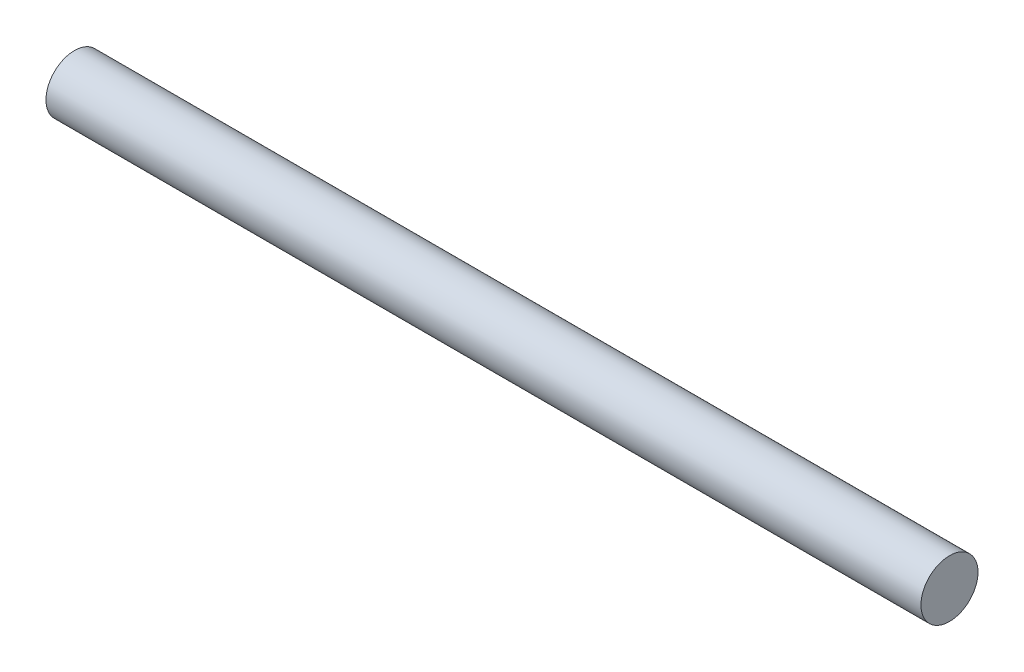
ISO-10303-21;
HEADER;
FILE_DESCRIPTION(('STEP AP214'),'2;1');
FILE_NAME('part.step','',(''),(''),'','','');
FILE_SCHEMA(('AUTOMOTIVE_DESIGN { 1 0 10303 214 1 1 1 1 }'));
ENDSEC;
DATA;
#1=APPLICATION_CONTEXT('core data for automotive mechanical design processes');
#2=APPLICATION_PROTOCOL_DEFINITION('international standard','automotive_design',2000,#1);
#3=PRODUCT_CONTEXT('',#1,'mechanical');
#4=PRODUCT('Part','Part','',(#3));
#5=PRODUCT_RELATED_PRODUCT_CATEGORY('part','',(#4));
#6=PRODUCT_DEFINITION_FORMATION('','',#4);
#7=PRODUCT_DEFINITION_CONTEXT('part definition',#1,'design');
#8=PRODUCT_DEFINITION('design','',#6,#7);
#9=PRODUCT_DEFINITION_SHAPE('','',#8);
#10=(LENGTH_UNIT() NAMED_UNIT(*) SI_UNIT(.MILLI.,.METRE.));
#11=(NAMED_UNIT(*) PLANE_ANGLE_UNIT() SI_UNIT($,.RADIAN.));
#12=(NAMED_UNIT(*) SI_UNIT($,.STERADIAN.) SOLID_ANGLE_UNIT());
#13=UNCERTAINTY_MEASURE_WITH_UNIT(LENGTH_MEASURE(1.E-05),#10,'distance_accuracy_value','');
#14=(GEOMETRIC_REPRESENTATION_CONTEXT(3) GLOBAL_UNCERTAINTY_ASSIGNED_CONTEXT((#13)) GLOBAL_UNIT_ASSIGNED_CONTEXT((#10,
#11,#12)) REPRESENTATION_CONTEXT('',''));
#15=CARTESIAN_POINT('',(0.,0.,0.));
#16=DIRECTION('',(0.,0.,1.));
#17=DIRECTION('',(1.,0.,0.));
#18=AXIS2_PLACEMENT_3D('',#15,#16,#17);
#19=CARTESIAN_POINT('',(46.,0.,0.));
#20=DIRECTION('',(-1.,0.,0.));
#21=DIRECTION('',(0.,0.,1.));
#22=AXIS2_PLACEMENT_3D('',#19,#20,#21);
#23=CYLINDRICAL_SURFACE('',#22,1.5);
#24=CARTESIAN_POINT('',(46.,0.,0.));
#25=DIRECTION('',(1.,0.,0.));
#26=DIRECTION('',(0.,0.,-1.));
#27=AXIS2_PLACEMENT_3D('',#24,#25,#26);
#28=CIRCLE('',#27,1.5);
#29=CARTESIAN_POINT('',(46.,0.,-1.5));
#30=VERTEX_POINT('',#29);
#31=EDGE_CURVE('E10',#30,#30,#28,.T.);
#32=ORIENTED_EDGE('',*,*,#31,.F.);
#33=EDGE_LOOP('',(#32));
#34=FACE_BOUND('',#33,.T.);
#35=CARTESIAN_POINT('',(0.,0.,0.));
#36=DIRECTION('',(1.,0.,0.));
#37=DIRECTION('',(0.,0.,-1.));
#38=AXIS2_PLACEMENT_3D('',#35,#36,#37);
#39=CIRCLE('',#38,1.5);
#40=CARTESIAN_POINT('',(0.,0.,-1.5));
#41=VERTEX_POINT('',#40);
#42=EDGE_CURVE('E34',#41,#41,#39,.T.);
#43=ORIENTED_EDGE('',*,*,#42,.T.);
#44=EDGE_LOOP('',(#43));
#45=FACE_BOUND('',#44,.T.);
#46=ADVANCED_FACE('F31',(#34,#45),#23,.T.);
#47=CARTESIAN_POINT('',(46.,0.,0.));
#48=DIRECTION('',(1.,0.,0.));
#49=DIRECTION('',(0.,0.,-1.));
#50=AXIS2_PLACEMENT_3D('',#47,#48,#49);
#51=PLANE('',#50);
#52=ORIENTED_EDGE('',*,*,#31,.T.);
#53=EDGE_LOOP('',(#52));
#54=FACE_BOUND('',#53,.T.);
#55=ADVANCED_FACE('F46',(#54),#51,.T.);
#56=CARTESIAN_POINT('',(0.,0.,0.));
#57=DIRECTION('',(1.,0.,0.));
#58=DIRECTION('',(0.,0.,-1.));
#59=AXIS2_PLACEMENT_3D('',#56,#57,#58);
#60=PLANE('',#59);
#61=ORIENTED_EDGE('',*,*,#42,.F.);
#62=EDGE_LOOP('',(#61));
#63=FACE_BOUND('',#62,.T.);
#64=ADVANCED_FACE('F44',(#63),#60,.F.);
#65=CLOSED_SHELL('',(#46,#55,#64));
#66=MANIFOLD_SOLID_BREP('B2',#65);
#67=ADVANCED_BREP_SHAPE_REPRESENTATION('',(#18,#66),#14);
#68=SHAPE_DEFINITION_REPRESENTATION(#9,#67);
ENDSEC;
END-ISO-10303-21;
